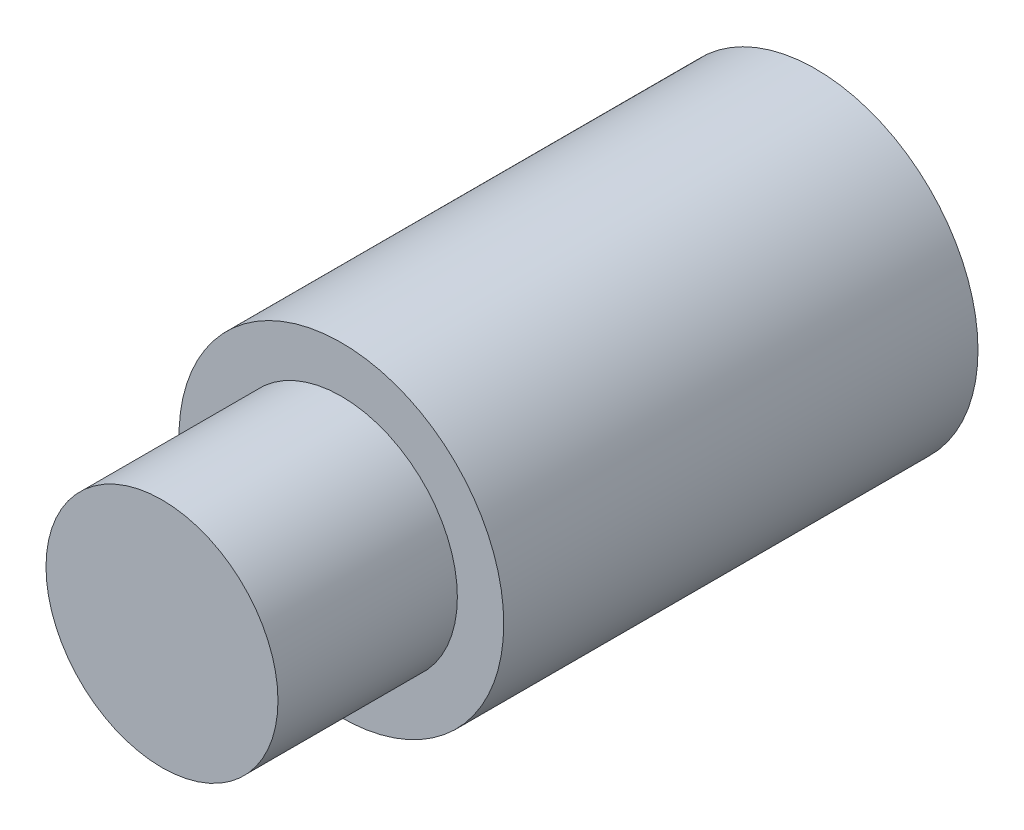
ISO-10303-21;
HEADER;
FILE_DESCRIPTION(('STEP AP214'),'2;1');
FILE_NAME('part.step','',(''),(''),'','','');
FILE_SCHEMA(('AUTOMOTIVE_DESIGN { 1 0 10303 214 1 1 1 1 }'));
ENDSEC;
DATA;
#1=APPLICATION_CONTEXT('core data for automotive mechanical design processes');
#2=APPLICATION_PROTOCOL_DEFINITION('international standard','automotive_design',2000,#1);
#3=PRODUCT_CONTEXT('',#1,'mechanical');
#4=PRODUCT('Part','Part','',(#3));
#5=PRODUCT_RELATED_PRODUCT_CATEGORY('part','',(#4));
#6=PRODUCT_DEFINITION_FORMATION('','',#4);
#7=PRODUCT_DEFINITION_CONTEXT('part definition',#1,'design');
#8=PRODUCT_DEFINITION('design','',#6,#7);
#9=PRODUCT_DEFINITION_SHAPE('','',#8);
#10=(LENGTH_UNIT() NAMED_UNIT(*) SI_UNIT(.MILLI.,.METRE.));
#11=(NAMED_UNIT(*) PLANE_ANGLE_UNIT() SI_UNIT($,.RADIAN.));
#12=(NAMED_UNIT(*) SI_UNIT($,.STERADIAN.) SOLID_ANGLE_UNIT());
#13=UNCERTAINTY_MEASURE_WITH_UNIT(LENGTH_MEASURE(1.E-05),#10,'distance_accuracy_value','');
#14=(GEOMETRIC_REPRESENTATION_CONTEXT(3) GLOBAL_UNCERTAINTY_ASSIGNED_CONTEXT((#13)) GLOBAL_UNIT_ASSIGNED_CONTEXT((#10,
#11,#12)) REPRESENTATION_CONTEXT('',''));
#15=CARTESIAN_POINT('',(0.,0.,0.));
#16=DIRECTION('',(0.,0.,1.));
#17=DIRECTION('',(1.,0.,0.));
#18=AXIS2_PLACEMENT_3D('',#15,#16,#17);
#19=CARTESIAN_POINT('',(0.,0.,11.684));
#20=DIRECTION('',(0.,0.,1.));
#21=DIRECTION('',(1.,0.,0.));
#22=AXIS2_PLACEMENT_3D('',#19,#20,#21);
#23=PLANE('',#22);
#24=CARTESIAN_POINT('',(0.,0.,11.684));
#25=DIRECTION('',(0.,0.,1.));
#26=DIRECTION('',(1.,0.,0.));
#27=AXIS2_PLACEMENT_3D('',#24,#25,#26);
#28=CIRCLE('',#27,4.0005);
#29=CARTESIAN_POINT('',(4.0005,0.,11.684));
#30=VERTEX_POINT('',#29);
#31=EDGE_CURVE('E10',#30,#30,#28,.T.);
#32=ORIENTED_EDGE('',*,*,#31,.T.);
#33=EDGE_LOOP('',(#32));
#34=FACE_BOUND('',#33,.T.);
#35=CARTESIAN_POINT('',(0.,0.,11.684));
#36=DIRECTION('',(0.,0.,1.));
#37=DIRECTION('',(1.,0.,0.));
#38=AXIS2_PLACEMENT_3D('',#35,#36,#37);
#39=CIRCLE('',#38,2.8575);
#40=CARTESIAN_POINT('',(2.8575,0.,11.684));
#41=VERTEX_POINT('',#40);
#42=EDGE_CURVE('E44',#41,#41,#39,.T.);
#43=ORIENTED_EDGE('',*,*,#42,.F.);
#44=EDGE_LOOP('',(#43));
#45=FACE_BOUND('',#44,.T.);
#46=ADVANCED_FACE('F31',(#34,#45),#23,.T.);
#47=CARTESIAN_POINT('',(0.,0.,11.684));
#48=DIRECTION('',(0.,0.,-1.));
#49=DIRECTION('',(-1.,0.,0.));
#50=AXIS2_PLACEMENT_3D('',#47,#48,#49);
#51=CYLINDRICAL_SURFACE('',#50,4.0005);
#52=ORIENTED_EDGE('',*,*,#31,.F.);
#53=EDGE_LOOP('',(#52));
#54=FACE_BOUND('',#53,.T.);
#55=CARTESIAN_POINT('',(0.,0.,0.));
#56=DIRECTION('',(0.,0.,1.));
#57=DIRECTION('',(1.,0.,0.));
#58=AXIS2_PLACEMENT_3D('',#55,#56,#57);
#59=CIRCLE('',#58,4.0005);
#60=CARTESIAN_POINT('',(4.0005,0.,0.));
#61=VERTEX_POINT('',#60);
#62=EDGE_CURVE('E35',#61,#61,#59,.T.);
#63=ORIENTED_EDGE('',*,*,#62,.T.);
#64=EDGE_LOOP('',(#63));
#65=FACE_BOUND('',#64,.T.);
#66=ADVANCED_FACE('F33',(#54,#65),#51,.T.);
#67=CARTESIAN_POINT('',(0.,0.,0.));
#68=DIRECTION('',(0.,0.,1.));
#69=DIRECTION('',(1.,0.,0.));
#70=AXIS2_PLACEMENT_3D('',#67,#68,#69);
#71=PLANE('',#70);
#72=ORIENTED_EDGE('',*,*,#62,.F.);
#73=EDGE_LOOP('',(#72));
#74=FACE_BOUND('',#73,.T.);
#75=ADVANCED_FACE('F55',(#74),#71,.F.);
#76=CARTESIAN_POINT('',(0.,0.,16.1036));
#77=DIRECTION('',(0.,0.,-1.));
#78=DIRECTION('',(-1.,0.,0.));
#79=AXIS2_PLACEMENT_3D('',#76,#77,#78);
#80=CYLINDRICAL_SURFACE('',#79,2.8575);
#81=CARTESIAN_POINT('',(0.,0.,16.1036));
#82=DIRECTION('',(0.,0.,1.));
#83=DIRECTION('',(1.,0.,0.));
#84=AXIS2_PLACEMENT_3D('',#81,#82,#83);
#85=CIRCLE('',#84,2.8575);
#86=CARTESIAN_POINT('',(2.8575,0.,16.1036));
#87=VERTEX_POINT('',#86);
#88=EDGE_CURVE('E42',#87,#87,#85,.T.);
#89=ORIENTED_EDGE('',*,*,#88,.F.);
#90=EDGE_LOOP('',(#89));
#91=FACE_BOUND('',#90,.T.);
#92=ORIENTED_EDGE('',*,*,#42,.T.);
#93=EDGE_LOOP('',(#92));
#94=FACE_BOUND('',#93,.T.);
#95=ADVANCED_FACE('F52',(#91,#94),#80,.T.);
#96=CARTESIAN_POINT('',(0.,0.,16.1036));
#97=DIRECTION('',(0.,0.,1.));
#98=DIRECTION('',(1.,0.,0.));
#99=AXIS2_PLACEMENT_3D('',#96,#97,#98);
#100=PLANE('',#99);
#101=ORIENTED_EDGE('',*,*,#88,.T.);
#102=EDGE_LOOP('',(#101));
#103=FACE_BOUND('',#102,.T.);
#104=ADVANCED_FACE('F50',(#103),#100,.T.);
#105=CLOSED_SHELL('',(#46,#66,#75,#95,#104));
#106=MANIFOLD_SOLID_BREP('B2',#105);
#107=ADVANCED_BREP_SHAPE_REPRESENTATION('',(#18,#106),#14);
#108=SHAPE_DEFINITION_REPRESENTATION(#9,#107);
ENDSEC;
END-ISO-10303-21;
